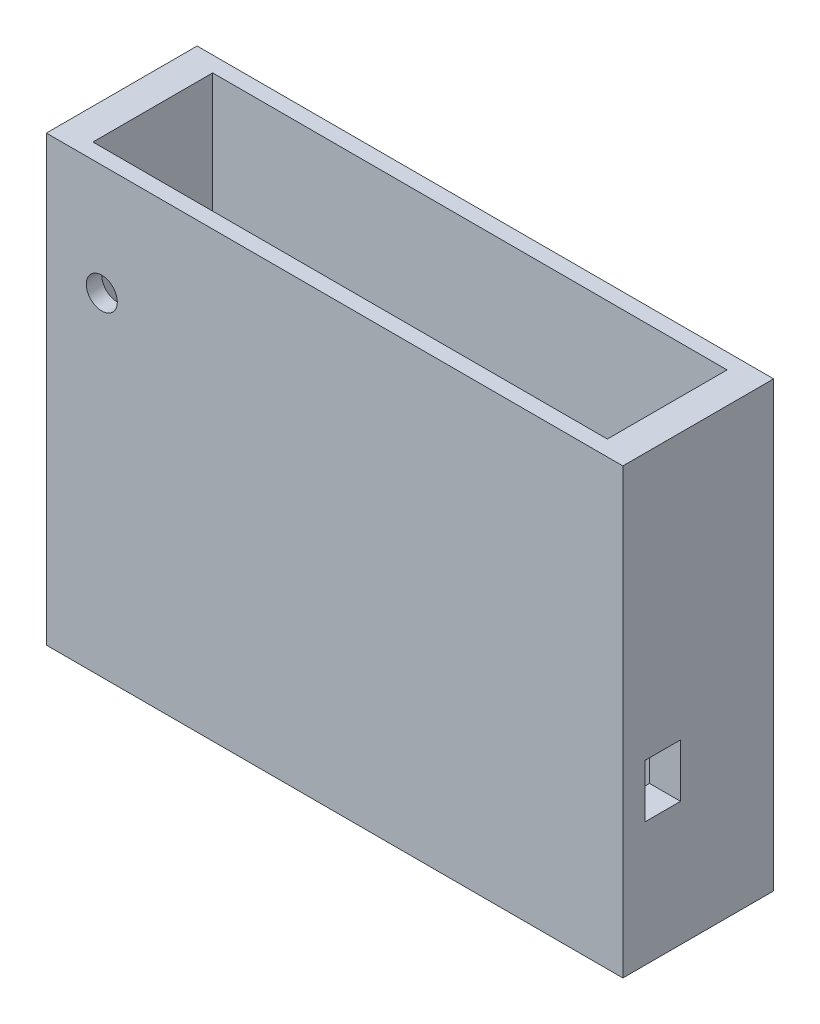
ISO-10303-21;
HEADER;
FILE_DESCRIPTION(('STEP AP214'),'2;1');
FILE_NAME('part.step','',(''),(''),'','','');
FILE_SCHEMA(('AUTOMOTIVE_DESIGN { 1 0 10303 214 1 1 1 1 }'));
ENDSEC;
DATA;
#1=APPLICATION_CONTEXT('core data for automotive mechanical design processes');
#2=APPLICATION_PROTOCOL_DEFINITION('international standard','automotive_design',2000,#1);
#3=PRODUCT_CONTEXT('',#1,'mechanical');
#4=PRODUCT('Part','Part','',(#3));
#5=PRODUCT_RELATED_PRODUCT_CATEGORY('part','',(#4));
#6=PRODUCT_DEFINITION_FORMATION('','',#4);
#7=PRODUCT_DEFINITION_CONTEXT('part definition',#1,'design');
#8=PRODUCT_DEFINITION('design','',#6,#7);
#9=PRODUCT_DEFINITION_SHAPE('','',#8);
#10=(LENGTH_UNIT() NAMED_UNIT(*) SI_UNIT(.MILLI.,.METRE.));
#11=(NAMED_UNIT(*) PLANE_ANGLE_UNIT() SI_UNIT($,.RADIAN.));
#12=(NAMED_UNIT(*) SI_UNIT($,.STERADIAN.) SOLID_ANGLE_UNIT());
#13=UNCERTAINTY_MEASURE_WITH_UNIT(LENGTH_MEASURE(1.E-05),#10,'distance_accuracy_value','');
#14=(GEOMETRIC_REPRESENTATION_CONTEXT(3) GLOBAL_UNCERTAINTY_ASSIGNED_CONTEXT((#13)) GLOBAL_UNIT_ASSIGNED_CONTEXT((#10,
#11,#12)) REPRESENTATION_CONTEXT('',''));
#15=CARTESIAN_POINT('',(0.,0.,0.));
#16=DIRECTION('',(0.,0.,1.));
#17=DIRECTION('',(1.,0.,0.));
#18=AXIS2_PLACEMENT_3D('',#15,#16,#17);
#19=CARTESIAN_POINT('',(-65.1773528308962,-39.2395711141537,34.));
#20=DIRECTION('',(0.,1.,0.));
#21=DIRECTION('',(0.,0.,1.));
#22=AXIS2_PLACEMENT_3D('',#19,#20,#21);
#23=PLANE('',#22);
#24=DIRECTION('',(1.,0.,0.));
#25=VECTOR('',#24,1.);
#26=CARTESIAN_POINT('',(-65.1773528308962,-39.2395711141537,0.));
#27=LINE('',#26,#25);
#28=CARTESIAN_POINT('',(-65.1773528308962,-39.2395711141537,0.));
#29=VERTEX_POINT('',#28);
#30=CARTESIAN_POINT('',(64.8226471691039,-39.2395711141537,0.));
#31=VERTEX_POINT('',#30);
#32=EDGE_CURVE('E224',#29,#31,#27,.T.);
#33=ORIENTED_EDGE('',*,*,#32,.T.);
#34=DIRECTION('',(0.,0.,-1.));
#35=VECTOR('',#34,1.);
#36=CARTESIAN_POINT('',(64.8226471691039,-39.2395711141537,34.));
#37=LINE('',#36,#35);
#38=CARTESIAN_POINT('',(64.8226471691039,-39.2395711141537,34.));
#39=VERTEX_POINT('',#38);
#40=EDGE_CURVE('E239',#39,#31,#37,.T.);
#41=ORIENTED_EDGE('',*,*,#40,.F.);
#42=DIRECTION('',(1.,0.,0.));
#43=VECTOR('',#42,1.);
#44=CARTESIAN_POINT('',(-65.1773528308962,-39.2395711141537,34.));
#45=LINE('',#44,#43);
#46=CARTESIAN_POINT('',(-65.1773528308962,-39.2395711141537,34.));
#47=VERTEX_POINT('',#46);
#48=EDGE_CURVE('E210',#47,#39,#45,.T.);
#49=ORIENTED_EDGE('',*,*,#48,.F.);
#50=DIRECTION('',(0.,0.,-1.));
#51=VECTOR('',#50,1.);
#52=CARTESIAN_POINT('',(-65.1773528308962,-39.2395711141537,34.));
#53=LINE('',#52,#51);
#54=EDGE_CURVE('E245',#47,#29,#53,.T.);
#55=ORIENTED_EDGE('',*,*,#54,.T.);
#56=EDGE_LOOP('',(#33,#41,#49,#55));
#57=FACE_BOUND('',#56,.T.);
#58=DIRECTION('',(0.,0.,-1.));
#59=VECTOR('',#58,1.);
#60=CARTESIAN_POINT('',(57.8226471691039,-39.2395711141537,30.5));
#61=LINE('',#60,#59);
#62=CARTESIAN_POINT('',(57.8226471691039,-39.2395711141537,30.5));
#63=VERTEX_POINT('',#62);
#64=CARTESIAN_POINT('',(57.8226471691039,-39.2395711141537,3.5));
#65=VERTEX_POINT('',#64);
#66=EDGE_CURVE('E172',#63,#65,#61,.T.);
#67=ORIENTED_EDGE('',*,*,#66,.T.);
#68=DIRECTION('',(1.,0.,0.));
#69=VECTOR('',#68,1.);
#70=CARTESIAN_POINT('',(-58.1773528308961,-39.2395711141537,3.5));
#71=LINE('',#70,#69);
#72=CARTESIAN_POINT('',(-58.1773528308961,-39.2395711141537,3.5));
#73=VERTEX_POINT('',#72);
#74=EDGE_CURVE('E179',#73,#65,#71,.T.);
#75=ORIENTED_EDGE('',*,*,#74,.F.);
#76=DIRECTION('',(0.,0.,-1.));
#77=VECTOR('',#76,1.);
#78=CARTESIAN_POINT('',(-58.1773528308962,-39.2395711141537,30.5));
#79=LINE('',#78,#77);
#80=CARTESIAN_POINT('',(-58.1773528308962,-39.2395711141537,30.5));
#81=VERTEX_POINT('',#80);
#82=EDGE_CURVE('E182',#81,#73,#79,.T.);
#83=ORIENTED_EDGE('',*,*,#82,.F.);
#84=DIRECTION('',(1.,0.,0.));
#85=VECTOR('',#84,1.);
#86=CARTESIAN_POINT('',(-58.1773528308962,-39.2395711141537,30.5));
#87=LINE('',#86,#85);
#88=EDGE_CURVE('E183',#81,#63,#87,.T.);
#89=ORIENTED_EDGE('',*,*,#88,.T.);
#90=EDGE_LOOP('',(#67,#75,#83,#89));
#91=FACE_BOUND('',#90,.T.);
#92=ADVANCED_FACE('F43',(#57,#91),#23,.F.);
#93=CARTESIAN_POINT('',(-65.1773528308962,60.7604288858463,34.));
#94=DIRECTION('',(0.,1.,0.));
#95=DIRECTION('',(0.,0.,1.));
#96=AXIS2_PLACEMENT_3D('',#93,#94,#95);
#97=PLANE('',#96);
#98=DIRECTION('',(1.,0.,0.));
#99=VECTOR('',#98,1.);
#100=CARTESIAN_POINT('',(-65.1773528308962,60.7604288858463,0.));
#101=LINE('',#100,#99);
#102=CARTESIAN_POINT('',(-65.1773528308962,60.7604288858463,0.));
#103=VERTEX_POINT('',#102);
#104=CARTESIAN_POINT('',(64.8226471691039,60.7604288858463,0.));
#105=VERTEX_POINT('',#104);
#106=EDGE_CURVE('E208',#103,#105,#101,.T.);
#107=ORIENTED_EDGE('',*,*,#106,.F.);
#108=DIRECTION('',(0.,0.,-1.));
#109=VECTOR('',#108,1.);
#110=CARTESIAN_POINT('',(-65.1773528308962,60.7604288858463,34.));
#111=LINE('',#110,#109);
#112=CARTESIAN_POINT('',(-65.1773528308962,60.7604288858463,34.));
#113=VERTEX_POINT('',#112);
#114=EDGE_CURVE('E218',#113,#103,#111,.T.);
#115=ORIENTED_EDGE('',*,*,#114,.F.);
#116=DIRECTION('',(1.,0.,0.));
#117=VECTOR('',#116,1.);
#118=CARTESIAN_POINT('',(-65.1773528308962,60.7604288858463,34.));
#119=LINE('',#118,#117);
#120=CARTESIAN_POINT('',(64.8226471691039,60.7604288858463,34.));
#121=VERTEX_POINT('',#120);
#122=EDGE_CURVE('E214',#113,#121,#119,.T.);
#123=ORIENTED_EDGE('',*,*,#122,.T.);
#124=DIRECTION('',(0.,0.,-1.));
#125=VECTOR('',#124,1.);
#126=CARTESIAN_POINT('',(64.8226471691039,60.7604288858463,34.));
#127=LINE('',#126,#125);
#128=EDGE_CURVE('E237',#121,#105,#127,.T.);
#129=ORIENTED_EDGE('',*,*,#128,.T.);
#130=EDGE_LOOP('',(#107,#115,#123,#129));
#131=FACE_BOUND('',#130,.T.);
#132=DIRECTION('',(-1.,0.,0.));
#133=VECTOR('',#132,1.);
#134=CARTESIAN_POINT('',(-65.1773528308962,60.7604288858463,3.5));
#135=LINE('',#134,#133);
#136=CARTESIAN_POINT('',(57.8226471691039,60.7604288858463,3.5));
#137=VERTEX_POINT('',#136);
#138=CARTESIAN_POINT('',(-58.1773528308961,60.7604288858463,3.5));
#139=VERTEX_POINT('',#138);
#140=EDGE_CURVE('E255',#137,#139,#135,.T.);
#141=ORIENTED_EDGE('',*,*,#140,.F.);
#142=DIRECTION('',(0.,0.,1.));
#143=VECTOR('',#142,1.);
#144=CARTESIAN_POINT('',(57.8226471691039,60.7604288858463,34.));
#145=LINE('',#144,#143);
#146=CARTESIAN_POINT('',(57.8226471691039,60.7604288858463,30.5));
#147=VERTEX_POINT('',#146);
#148=EDGE_CURVE('E260',#137,#147,#145,.T.);
#149=ORIENTED_EDGE('',*,*,#148,.T.);
#150=DIRECTION('',(-1.,0.,0.));
#151=VECTOR('',#150,1.);
#152=CARTESIAN_POINT('',(-65.1773528308962,60.7604288858463,30.5));
#153=LINE('',#152,#151);
#154=CARTESIAN_POINT('',(-58.1773528308962,60.7604288858463,30.5));
#155=VERTEX_POINT('',#154);
#156=EDGE_CURVE('E247',#147,#155,#153,.T.);
#157=ORIENTED_EDGE('',*,*,#156,.T.);
#158=DIRECTION('',(0.,0.,1.));
#159=VECTOR('',#158,1.);
#160=CARTESIAN_POINT('',(-58.1773528308962,60.7604288858463,34.));
#161=LINE('',#160,#159);
#162=EDGE_CURVE('E248',#139,#155,#161,.T.);
#163=ORIENTED_EDGE('',*,*,#162,.F.);
#164=EDGE_LOOP('',(#141,#149,#157,#163));
#165=FACE_BOUND('',#164,.T.);
#166=ADVANCED_FACE('F296',(#131,#165),#97,.T.);
#167=CARTESIAN_POINT('',(-65.1773528308962,60.7604288858463,34.));
#168=DIRECTION('',(1.,0.,0.));
#169=DIRECTION('',(0.,0.,-1.));
#170=AXIS2_PLACEMENT_3D('',#167,#168,#169);
#171=PLANE('',#170);
#172=DIRECTION('',(0.,-1.,0.));
#173=VECTOR('',#172,1.);
#174=CARTESIAN_POINT('',(-65.1773528308962,60.7604288858463,0.));
#175=LINE('',#174,#173);
#176=EDGE_CURVE('E205',#103,#29,#175,.T.);
#177=ORIENTED_EDGE('',*,*,#176,.T.);
#178=ORIENTED_EDGE('',*,*,#54,.F.);
#179=DIRECTION('',(0.,-1.,0.));
#180=VECTOR('',#179,1.);
#181=CARTESIAN_POINT('',(-65.1773528308962,60.7604288858463,34.));
#182=LINE('',#181,#180);
#183=EDGE_CURVE('E201',#113,#47,#182,.T.);
#184=ORIENTED_EDGE('',*,*,#183,.F.);
#185=ORIENTED_EDGE('',*,*,#114,.T.);
#186=EDGE_LOOP('',(#177,#178,#184,#185));
#187=FACE_BOUND('',#186,.T.);
#188=ADVANCED_FACE('F44',(#187),#171,.F.);
#189=CARTESIAN_POINT('',(64.8226471691039,60.7604288858463,34.));
#190=DIRECTION('',(1.,0.,0.));
#191=DIRECTION('',(0.,1.,0.));
#192=AXIS2_PLACEMENT_3D('',#189,#190,#191);
#193=PLANE('',#192);
#194=DIRECTION('',(0.,0.,1.));
#195=VECTOR('',#194,1.);
#196=CARTESIAN_POINT('',(64.8226471691039,0.760428885846302,29.));
#197=LINE('',#196,#195);
#198=CARTESIAN_POINT('',(64.8226471691039,0.760428885846302,21.));
#199=VERTEX_POINT('',#198);
#200=CARTESIAN_POINT('',(64.8226471691039,0.7604288858463,29.));
#201=VERTEX_POINT('',#200);
#202=EDGE_CURVE('E56',#199,#201,#197,.T.);
#203=ORIENTED_EDGE('',*,*,#202,.F.);
#204=DIRECTION('',(0.,1.,0.));
#205=VECTOR('',#204,1.);
#206=CARTESIAN_POINT('',(64.8226471691039,0.760428885846302,21.));
#207=LINE('',#206,#205);
#208=CARTESIAN_POINT('',(64.8226471691039,-11.2395711141537,21.));
#209=VERTEX_POINT('',#208);
#210=EDGE_CURVE('E153',#209,#199,#207,.T.);
#211=ORIENTED_EDGE('',*,*,#210,.F.);
#212=DIRECTION('',(0.,0.,-1.));
#213=VECTOR('',#212,1.);
#214=CARTESIAN_POINT('',(64.8226471691039,-11.2395711141537,29.));
#215=LINE('',#214,#213);
#216=CARTESIAN_POINT('',(64.8226471691039,-11.2395711141537,29.));
#217=VERTEX_POINT('',#216);
#218=EDGE_CURVE('E134',#217,#209,#215,.T.);
#219=ORIENTED_EDGE('',*,*,#218,.F.);
#220=DIRECTION('',(0.,-1.,0.));
#221=VECTOR('',#220,1.);
#222=CARTESIAN_POINT('',(64.8226471691039,0.760428885846302,29.));
#223=LINE('',#222,#221);
#224=EDGE_CURVE('E144',#201,#217,#223,.T.);
#225=ORIENTED_EDGE('',*,*,#224,.F.);
#226=EDGE_LOOP('',(#203,#211,#219,#225));
#227=FACE_BOUND('',#226,.T.);
#228=DIRECTION('',(0.,-1.,0.));
#229=VECTOR('',#228,1.);
#230=CARTESIAN_POINT('',(64.8226471691039,60.7604288858463,0.));
#231=LINE('',#230,#229);
#232=EDGE_CURVE('E230',#105,#31,#231,.T.);
#233=ORIENTED_EDGE('',*,*,#232,.F.);
#234=ORIENTED_EDGE('',*,*,#128,.F.);
#235=DIRECTION('',(0.,-1.,0.));
#236=VECTOR('',#235,1.);
#237=CARTESIAN_POINT('',(64.8226471691039,60.7604288858463,34.));
#238=LINE('',#237,#236);
#239=EDGE_CURVE('E211',#121,#39,#238,.T.);
#240=ORIENTED_EDGE('',*,*,#239,.T.);
#241=ORIENTED_EDGE('',*,*,#40,.T.);
#242=EDGE_LOOP('',(#233,#234,#240,#241));
#243=FACE_BOUND('',#242,.T.);
#244=ADVANCED_FACE('F147',(#227,#243),#193,.T.);
#245=CARTESIAN_POINT('',(0.,0.,34.));
#246=DIRECTION('',(0.,0.,1.));
#247=DIRECTION('',(1.,0.,0.));
#248=AXIS2_PLACEMENT_3D('',#245,#246,#247);
#249=PLANE('',#248);
#250=CARTESIAN_POINT('',(-52.6773528308962,35.7604288858463,34.));
#251=DIRECTION('',(0.,0.,1.));
#252=DIRECTION('',(1.,0.,0.));
#253=AXIS2_PLACEMENT_3D('',#250,#251,#252);
#254=CIRCLE('',#253,3.5);
#255=CARTESIAN_POINT('',(-49.1773528308962,35.7604288858463,34.));
#256=VERTEX_POINT('',#255);
#257=EDGE_CURVE('E163',#256,#256,#254,.T.);
#258=ORIENTED_EDGE('',*,*,#257,.F.);
#259=EDGE_LOOP('',(#258));
#260=FACE_BOUND('',#259,.T.);
#261=ORIENTED_EDGE('',*,*,#183,.T.);
#262=ORIENTED_EDGE('',*,*,#48,.T.);
#263=ORIENTED_EDGE('',*,*,#239,.F.);
#264=ORIENTED_EDGE('',*,*,#122,.F.);
#265=EDGE_LOOP('',(#261,#262,#263,#264));
#266=FACE_BOUND('',#265,.T.);
#267=ADVANCED_FACE('F307',(#260,#266),#249,.T.);
#268=CARTESIAN_POINT('',(0.,0.,0.));
#269=DIRECTION('',(0.,0.,1.));
#270=DIRECTION('',(1.,0.,0.));
#271=AXIS2_PLACEMENT_3D('',#268,#269,#270);
#272=PLANE('',#271);
#273=ORIENTED_EDGE('',*,*,#176,.F.);
#274=ORIENTED_EDGE('',*,*,#106,.T.);
#275=ORIENTED_EDGE('',*,*,#232,.T.);
#276=ORIENTED_EDGE('',*,*,#32,.F.);
#277=EDGE_LOOP('',(#273,#274,#275,#276));
#278=FACE_BOUND('',#277,.T.);
#279=ADVANCED_FACE('F310',(#278),#272,.F.);
#280=CARTESIAN_POINT('',(57.8226471691039,66.7604288858464,30.5));
#281=DIRECTION('',(-1.,0.,0.));
#282=DIRECTION('',(0.,0.,1.));
#283=AXIS2_PLACEMENT_3D('',#280,#281,#282);
#284=PLANE('',#283);
#285=DIRECTION('',(0.,0.,-1.));
#286=VECTOR('',#285,1.);
#287=CARTESIAN_POINT('',(57.8226471691039,0.760428885846307,30.5));
#288=LINE('',#287,#286);
#289=CARTESIAN_POINT('',(57.8226471691039,0.760428885846301,29.));
#290=VERTEX_POINT('',#289);
#291=CARTESIAN_POINT('',(57.8226471691039,0.760428885846301,21.));
#292=VERTEX_POINT('',#291);
#293=EDGE_CURVE('E11',#290,#292,#288,.T.);
#294=ORIENTED_EDGE('',*,*,#293,.F.);
#295=DIRECTION('',(0.,1.,0.));
#296=VECTOR('',#295,1.);
#297=CARTESIAN_POINT('',(57.8226471691039,66.7604288858464,29.));
#298=LINE('',#297,#296);
#299=CARTESIAN_POINT('',(57.8226471691039,-11.2395711141537,29.));
#300=VERTEX_POINT('',#299);
#301=EDGE_CURVE('E261',#300,#290,#298,.T.);
#302=ORIENTED_EDGE('',*,*,#301,.F.);
#303=DIRECTION('',(0.,0.,1.));
#304=VECTOR('',#303,1.);
#305=CARTESIAN_POINT('',(57.8226471691039,-11.2395711141537,30.5));
#306=LINE('',#305,#304);
#307=CARTESIAN_POINT('',(57.8226471691039,-11.2395711141537,21.));
#308=VERTEX_POINT('',#307);
#309=EDGE_CURVE('E140',#308,#300,#306,.T.);
#310=ORIENTED_EDGE('',*,*,#309,.F.);
#311=DIRECTION('',(0.,-1.,0.));
#312=VECTOR('',#311,1.);
#313=CARTESIAN_POINT('',(57.8226471691039,66.7604288858464,21.));
#314=LINE('',#313,#312);
#315=EDGE_CURVE('E55',#292,#308,#314,.T.);
#316=ORIENTED_EDGE('',*,*,#315,.F.);
#317=EDGE_LOOP('',(#294,#302,#310,#316));
#318=FACE_BOUND('',#317,.T.);
#319=DIRECTION('',(0.,-1.,0.));
#320=VECTOR('',#319,1.);
#321=CARTESIAN_POINT('',(57.8226471691039,66.7604288858464,3.5));
#322=LINE('',#321,#320);
#323=EDGE_CURVE('E200',#137,#65,#322,.T.);
#324=ORIENTED_EDGE('',*,*,#323,.T.);
#325=ORIENTED_EDGE('',*,*,#66,.F.);
#326=DIRECTION('',(0.,-1.,0.));
#327=VECTOR('',#326,1.);
#328=CARTESIAN_POINT('',(57.8226471691039,66.7604288858464,30.5));
#329=LINE('',#328,#327);
#330=EDGE_CURVE('E188',#147,#63,#329,.T.);
#331=ORIENTED_EDGE('',*,*,#330,.F.);
#332=ORIENTED_EDGE('',*,*,#148,.F.);
#333=EDGE_LOOP('',(#324,#325,#331,#332));
#334=FACE_BOUND('',#333,.T.);
#335=ADVANCED_FACE('F277',(#318,#334),#284,.T.);
#336=CARTESIAN_POINT('',(-58.1773528308961,66.7604288858464,3.5));
#337=DIRECTION('',(0.,0.,-1.));
#338=DIRECTION('',(-1.,0.,0.));
#339=AXIS2_PLACEMENT_3D('',#336,#337,#338);
#340=PLANE('',#339);
#341=ORIENTED_EDGE('',*,*,#140,.T.);
#342=DIRECTION('',(0.,-1.,0.));
#343=VECTOR('',#342,1.);
#344=CARTESIAN_POINT('',(-58.1773528308961,66.7604288858464,3.5));
#345=LINE('',#344,#343);
#346=EDGE_CURVE('E198',#139,#73,#345,.T.);
#347=ORIENTED_EDGE('',*,*,#346,.T.);
#348=ORIENTED_EDGE('',*,*,#74,.T.);
#349=ORIENTED_EDGE('',*,*,#323,.F.);
#350=EDGE_LOOP('',(#341,#347,#348,#349));
#351=FACE_BOUND('',#350,.T.);
#352=ADVANCED_FACE('F316',(#351),#340,.F.);
#353=CARTESIAN_POINT('',(-58.1773528308962,66.7604288858464,30.5));
#354=DIRECTION('',(-1.,0.,0.));
#355=DIRECTION('',(0.,0.,1.));
#356=AXIS2_PLACEMENT_3D('',#353,#354,#355);
#357=PLANE('',#356);
#358=ORIENTED_EDGE('',*,*,#162,.T.);
#359=DIRECTION('',(0.,-1.,0.));
#360=VECTOR('',#359,1.);
#361=CARTESIAN_POINT('',(-58.1773528308962,66.7604288858464,30.5));
#362=LINE('',#361,#360);
#363=EDGE_CURVE('E195',#155,#81,#362,.T.);
#364=ORIENTED_EDGE('',*,*,#363,.T.);
#365=ORIENTED_EDGE('',*,*,#82,.T.);
#366=ORIENTED_EDGE('',*,*,#346,.F.);
#367=EDGE_LOOP('',(#358,#364,#365,#366));
#368=FACE_BOUND('',#367,.T.);
#369=ADVANCED_FACE('F317',(#368),#357,.F.);
#370=CARTESIAN_POINT('',(-58.1773528308962,66.7604288858464,30.5));
#371=DIRECTION('',(0.,0.,-1.));
#372=DIRECTION('',(-1.,0.,0.));
#373=AXIS2_PLACEMENT_3D('',#370,#371,#372);
#374=PLANE('',#373);
#375=CARTESIAN_POINT('',(-52.6773528308962,35.7604288858463,30.5));
#376=DIRECTION('',(0.,0.,-1.));
#377=DIRECTION('',(-1.,0.,0.));
#378=AXIS2_PLACEMENT_3D('',#375,#376,#377);
#379=CIRCLE('',#378,3.5);
#380=CARTESIAN_POINT('',(-56.1773528308962,35.7604288858463,30.5));
#381=VERTEX_POINT('',#380);
#382=EDGE_CURVE('E175',#381,#381,#379,.T.);
#383=ORIENTED_EDGE('',*,*,#382,.F.);
#384=EDGE_LOOP('',(#383));
#385=FACE_BOUND('',#384,.T.);
#386=ORIENTED_EDGE('',*,*,#330,.T.);
#387=ORIENTED_EDGE('',*,*,#88,.F.);
#388=ORIENTED_EDGE('',*,*,#363,.F.);
#389=ORIENTED_EDGE('',*,*,#156,.F.);
#390=EDGE_LOOP('',(#386,#387,#388,#389));
#391=FACE_BOUND('',#390,.T.);
#392=ADVANCED_FACE('F292',(#385,#391),#374,.T.);
#393=CARTESIAN_POINT('',(-52.6773528308962,35.7604288858463,24.));
#394=DIRECTION('',(0.,0.,1.));
#395=DIRECTION('',(1.,0.,0.));
#396=AXIS2_PLACEMENT_3D('',#393,#394,#395);
#397=CYLINDRICAL_SURFACE('',#396,3.5);
#398=ORIENTED_EDGE('',*,*,#382,.T.);
#399=EDGE_LOOP('',(#398));
#400=FACE_BOUND('',#399,.T.);
#401=ORIENTED_EDGE('',*,*,#257,.T.);
#402=EDGE_LOOP('',(#401));
#403=FACE_BOUND('',#402,.T.);
#404=ADVANCED_FACE('F282',(#400,#403),#397,.F.);
#405=CARTESIAN_POINT('',(54.8226471691039,0.7604288858463,29.));
#406=DIRECTION('',(0.,1.,0.));
#407=DIRECTION('',(-1.,0.,0.));
#408=AXIS2_PLACEMENT_3D('',#405,#406,#407);
#409=PLANE('',#408);
#410=ORIENTED_EDGE('',*,*,#293,.T.);
#411=DIRECTION('',(1.,0.,0.));
#412=VECTOR('',#411,1.);
#413=CARTESIAN_POINT('',(54.8226471691039,0.7604288858463,21.));
#414=LINE('',#413,#412);
#415=EDGE_CURVE('E161',#292,#199,#414,.T.);
#416=ORIENTED_EDGE('',*,*,#415,.T.);
#417=ORIENTED_EDGE('',*,*,#202,.T.);
#418=DIRECTION('',(1.,0.,0.));
#419=VECTOR('',#418,1.);
#420=CARTESIAN_POINT('',(54.8226471691039,0.7604288858463,29.));
#421=LINE('',#420,#419);
#422=EDGE_CURVE('E142',#290,#201,#421,.T.);
#423=ORIENTED_EDGE('',*,*,#422,.F.);
#424=EDGE_LOOP('',(#410,#416,#417,#423));
#425=FACE_BOUND('',#424,.T.);
#426=ADVANCED_FACE('F279',(#425),#409,.F.);
#427=CARTESIAN_POINT('',(54.8226471691039,0.7604288858463,21.));
#428=DIRECTION('',(0.,0.,-1.));
#429=DIRECTION('',(0.,1.,0.));
#430=AXIS2_PLACEMENT_3D('',#427,#428,#429);
#431=PLANE('',#430);
#432=ORIENTED_EDGE('',*,*,#315,.T.);
#433=DIRECTION('',(1.,0.,0.));
#434=VECTOR('',#433,1.);
#435=CARTESIAN_POINT('',(54.8226471691039,-11.2395711141537,21.));
#436=LINE('',#435,#434);
#437=EDGE_CURVE('E143',#308,#209,#436,.T.);
#438=ORIENTED_EDGE('',*,*,#437,.T.);
#439=ORIENTED_EDGE('',*,*,#210,.T.);
#440=ORIENTED_EDGE('',*,*,#415,.F.);
#441=EDGE_LOOP('',(#432,#438,#439,#440));
#442=FACE_BOUND('',#441,.T.);
#443=ADVANCED_FACE('F272',(#442),#431,.F.);
#444=CARTESIAN_POINT('',(54.8226471691039,-11.2395711141537,29.));
#445=DIRECTION('',(0.,-1.,0.));
#446=DIRECTION('',(1.,0.,0.));
#447=AXIS2_PLACEMENT_3D('',#444,#445,#446);
#448=PLANE('',#447);
#449=ORIENTED_EDGE('',*,*,#309,.T.);
#450=DIRECTION('',(1.,0.,0.));
#451=VECTOR('',#450,1.);
#452=CARTESIAN_POINT('',(54.8226471691039,-11.2395711141537,29.));
#453=LINE('',#452,#451);
#454=EDGE_CURVE('E69',#300,#217,#453,.T.);
#455=ORIENTED_EDGE('',*,*,#454,.T.);
#456=ORIENTED_EDGE('',*,*,#218,.T.);
#457=ORIENTED_EDGE('',*,*,#437,.F.);
#458=EDGE_LOOP('',(#449,#455,#456,#457));
#459=FACE_BOUND('',#458,.T.);
#460=ADVANCED_FACE('F135',(#459),#448,.F.);
#461=CARTESIAN_POINT('',(54.8226471691039,0.7604288858463,29.));
#462=DIRECTION('',(0.,0.,1.));
#463=DIRECTION('',(1.,0.,0.));
#464=AXIS2_PLACEMENT_3D('',#461,#462,#463);
#465=PLANE('',#464);
#466=ORIENTED_EDGE('',*,*,#301,.T.);
#467=ORIENTED_EDGE('',*,*,#422,.T.);
#468=ORIENTED_EDGE('',*,*,#224,.T.);
#469=ORIENTED_EDGE('',*,*,#454,.F.);
#470=EDGE_LOOP('',(#466,#467,#468,#469));
#471=FACE_BOUND('',#470,.T.);
#472=ADVANCED_FACE('F148',(#471),#465,.F.);
#473=CLOSED_SHELL('',(#92,#166,#188,#244,#267,#279,#335,#352,#369,#392,#404,#426,#443,#460,#472));
#474=MANIFOLD_SOLID_BREP('B2',#473);
#475=ADVANCED_BREP_SHAPE_REPRESENTATION('',(#18,#474),#14);
#476=SHAPE_DEFINITION_REPRESENTATION(#9,#475);
ENDSEC;
END-ISO-10303-21;
